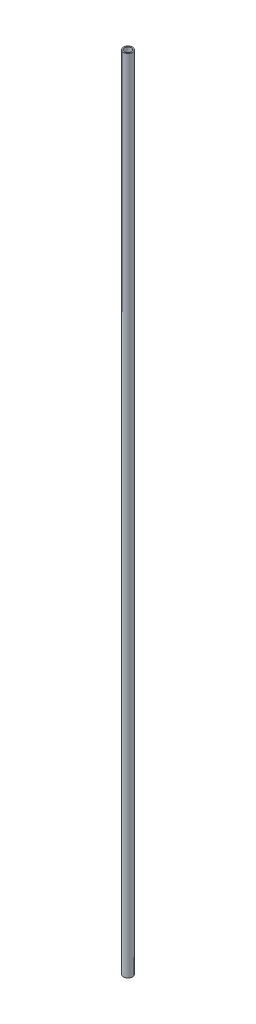
ISO-10303-21;
HEADER;
FILE_DESCRIPTION(('STEP AP214'),'2;1');
FILE_NAME('part.step','',(''),(''),'','','');
FILE_SCHEMA(('AUTOMOTIVE_DESIGN { 1 0 10303 214 1 1 1 1 }'));
ENDSEC;
DATA;
#1=APPLICATION_CONTEXT('core data for automotive mechanical design processes');
#2=APPLICATION_PROTOCOL_DEFINITION('international standard','automotive_design',2000,#1);
#3=PRODUCT_CONTEXT('',#1,'mechanical');
#4=PRODUCT('Part','Part','',(#3));
#5=PRODUCT_RELATED_PRODUCT_CATEGORY('part','',(#4));
#6=PRODUCT_DEFINITION_FORMATION('','',#4);
#7=PRODUCT_DEFINITION_CONTEXT('part definition',#1,'design');
#8=PRODUCT_DEFINITION('design','',#6,#7);
#9=PRODUCT_DEFINITION_SHAPE('','',#8);
#10=(LENGTH_UNIT() NAMED_UNIT(*) SI_UNIT(.MILLI.,.METRE.));
#11=(NAMED_UNIT(*) PLANE_ANGLE_UNIT() SI_UNIT($,.RADIAN.));
#12=(NAMED_UNIT(*) SI_UNIT($,.STERADIAN.) SOLID_ANGLE_UNIT());
#13=UNCERTAINTY_MEASURE_WITH_UNIT(LENGTH_MEASURE(1.E-05),#10,'distance_accuracy_value','');
#14=(GEOMETRIC_REPRESENTATION_CONTEXT(3) GLOBAL_UNCERTAINTY_ASSIGNED_CONTEXT((#13)) GLOBAL_UNIT_ASSIGNED_CONTEXT((#10,
#11,#12)) REPRESENTATION_CONTEXT('',''));
#15=CARTESIAN_POINT('',(0.,0.,0.));
#16=DIRECTION('',(0.,0.,1.));
#17=DIRECTION('',(1.,0.,0.));
#18=AXIS2_PLACEMENT_3D('',#15,#16,#17);
#19=CARTESIAN_POINT('',(0.,0.,0.));
#20=DIRECTION('',(0.,1.,0.));
#21=DIRECTION('',(0.,0.,1.));
#22=AXIS2_PLACEMENT_3D('',#19,#20,#21);
#23=CYLINDRICAL_SURFACE('',#22,4.);
#24=CARTESIAN_POINT('',(0.,700.,0.));
#25=DIRECTION('',(0.,1.,0.));
#26=DIRECTION('',(0.,0.,1.));
#27=AXIS2_PLACEMENT_3D('',#24,#25,#26);
#28=CIRCLE('',#27,4.);
#29=CARTESIAN_POINT('',(0.,700.,4.));
#30=VERTEX_POINT('',#29);
#31=EDGE_CURVE('E60',#30,#30,#28,.T.);
#32=ORIENTED_EDGE('',*,*,#31,.F.);
#33=EDGE_LOOP('',(#32));
#34=FACE_BOUND('',#33,.T.);
#35=CARTESIAN_POINT('',(0.,0.,0.));
#36=DIRECTION('',(0.,1.,0.));
#37=DIRECTION('',(0.,0.,1.));
#38=AXIS2_PLACEMENT_3D('',#35,#36,#37);
#39=CIRCLE('',#38,4.);
#40=CARTESIAN_POINT('',(0.,0.,4.));
#41=VERTEX_POINT('',#40);
#42=EDGE_CURVE('E45',#41,#41,#39,.T.);
#43=ORIENTED_EDGE('',*,*,#42,.T.);
#44=EDGE_LOOP('',(#43));
#45=FACE_BOUND('',#44,.T.);
#46=ADVANCED_FACE('F42',(#34,#45),#23,.T.);
#47=CARTESIAN_POINT('',(0.,0.,0.));
#48=DIRECTION('',(0.,1.,0.));
#49=DIRECTION('',(0.,0.,1.));
#50=AXIS2_PLACEMENT_3D('',#47,#48,#49);
#51=PLANE('',#50);
#52=CARTESIAN_POINT('',(0.,0.,0.));
#53=DIRECTION('',(0.,1.,0.));
#54=DIRECTION('',(0.,0.,1.));
#55=AXIS2_PLACEMENT_3D('',#52,#53,#54);
#56=CIRCLE('',#55,3.);
#57=CARTESIAN_POINT('',(0.,0.,3.));
#58=VERTEX_POINT('',#57);
#59=EDGE_CURVE('E50',#58,#58,#56,.F.);
#60=ORIENTED_EDGE('',*,*,#59,.F.);
#61=EDGE_LOOP('',(#60));
#62=FACE_BOUND('',#61,.T.);
#63=ORIENTED_EDGE('',*,*,#42,.F.);
#64=EDGE_LOOP('',(#63));
#65=FACE_BOUND('',#64,.T.);
#66=ADVANCED_FACE('F78',(#62,#65),#51,.F.);
#67=CARTESIAN_POINT('',(0.,700.,0.));
#68=DIRECTION('',(0.,1.,0.));
#69=DIRECTION('',(0.,0.,1.));
#70=AXIS2_PLACEMENT_3D('',#67,#68,#69);
#71=PLANE('',#70);
#72=CARTESIAN_POINT('',(0.,700.,0.));
#73=DIRECTION('',(0.,1.,0.));
#74=DIRECTION('',(0.,0.,1.));
#75=AXIS2_PLACEMENT_3D('',#72,#73,#74);
#76=CIRCLE('',#75,3.);
#77=CARTESIAN_POINT('',(0.,700.,3.));
#78=VERTEX_POINT('',#77);
#79=EDGE_CURVE('E13',#78,#78,#76,.F.);
#80=ORIENTED_EDGE('',*,*,#79,.T.);
#81=EDGE_LOOP('',(#80));
#82=FACE_BOUND('',#81,.T.);
#83=ORIENTED_EDGE('',*,*,#31,.T.);
#84=EDGE_LOOP('',(#83));
#85=FACE_BOUND('',#84,.T.);
#86=ADVANCED_FACE('F67',(#82,#85),#71,.T.);
#87=CARTESIAN_POINT('',(0.,0.,0.));
#88=DIRECTION('',(0.,1.,0.));
#89=DIRECTION('',(0.,0.,1.));
#90=AXIS2_PLACEMENT_3D('',#87,#88,#89);
#91=CYLINDRICAL_SURFACE('',#90,3.);
#92=ORIENTED_EDGE('',*,*,#79,.F.);
#93=EDGE_LOOP('',(#92));
#94=FACE_BOUND('',#93,.T.);
#95=ORIENTED_EDGE('',*,*,#59,.T.);
#96=EDGE_LOOP('',(#95));
#97=FACE_BOUND('',#96,.T.);
#98=ADVANCED_FACE('F70',(#94,#97),#91,.F.);
#99=CLOSED_SHELL('',(#46,#66,#86,#98));
#100=MANIFOLD_SOLID_BREP('B2',#99);
#101=ADVANCED_BREP_SHAPE_REPRESENTATION('',(#18,#100),#14);
#102=SHAPE_DEFINITION_REPRESENTATION(#9,#101);
ENDSEC;
END-ISO-10303-21;
